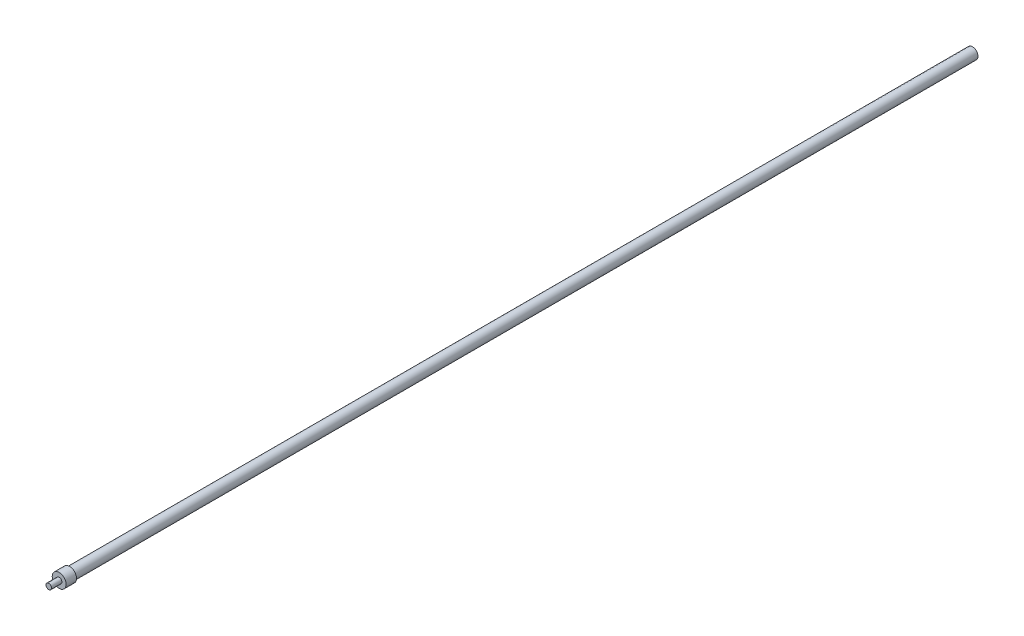
ISO-10303-21;
HEADER;
FILE_DESCRIPTION(('STEP AP214'),'2;1');
FILE_NAME('part.step','',(''),(''),'','','');
FILE_SCHEMA(('AUTOMOTIVE_DESIGN { 1 0 10303 214 1 1 1 1 }'));
ENDSEC;
DATA;
#1=APPLICATION_CONTEXT('core data for automotive mechanical design processes');
#2=APPLICATION_PROTOCOL_DEFINITION('international standard','automotive_design',2000,#1);
#3=PRODUCT_CONTEXT('',#1,'mechanical');
#4=PRODUCT('Part','Part','',(#3));
#5=PRODUCT_RELATED_PRODUCT_CATEGORY('part','',(#4));
#6=PRODUCT_DEFINITION_FORMATION('','',#4);
#7=PRODUCT_DEFINITION_CONTEXT('part definition',#1,'design');
#8=PRODUCT_DEFINITION('design','',#6,#7);
#9=PRODUCT_DEFINITION_SHAPE('','',#8);
#10=(LENGTH_UNIT() NAMED_UNIT(*) SI_UNIT(.MILLI.,.METRE.));
#11=(NAMED_UNIT(*) PLANE_ANGLE_UNIT() SI_UNIT($,.RADIAN.));
#12=(NAMED_UNIT(*) SI_UNIT($,.STERADIAN.) SOLID_ANGLE_UNIT());
#13=UNCERTAINTY_MEASURE_WITH_UNIT(LENGTH_MEASURE(1.E-05),#10,'distance_accuracy_value','');
#14=(GEOMETRIC_REPRESENTATION_CONTEXT(3) GLOBAL_UNCERTAINTY_ASSIGNED_CONTEXT((#13)) GLOBAL_UNIT_ASSIGNED_CONTEXT((#10,
#11,#12)) REPRESENTATION_CONTEXT('',''));
#15=CARTESIAN_POINT('',(0.,0.,0.));
#16=DIRECTION('',(0.,0.,1.));
#17=DIRECTION('',(1.,0.,0.));
#18=AXIS2_PLACEMENT_3D('',#15,#16,#17);
#19=CARTESIAN_POINT('',(0.,0.,1040.));
#20=DIRECTION('',(0.,0.,-1.));
#21=DIRECTION('',(-1.,0.,0.));
#22=AXIS2_PLACEMENT_3D('',#19,#20,#21);
#23=CYLINDRICAL_SURFACE('',#22,6.35);
#24=CARTESIAN_POINT('',(0.,0.,1040.));
#25=DIRECTION('',(0.,0.,1.));
#26=DIRECTION('',(1.,0.,0.));
#27=AXIS2_PLACEMENT_3D('',#24,#25,#26);
#28=CIRCLE('',#27,6.35);
#29=CARTESIAN_POINT('',(6.35,0.,1040.));
#30=VERTEX_POINT('',#29);
#31=EDGE_CURVE('E10',#30,#30,#28,.T.);
#32=ORIENTED_EDGE('',*,*,#31,.F.);
#33=EDGE_LOOP('',(#32));
#34=FACE_BOUND('',#33,.T.);
#35=CARTESIAN_POINT('',(0.,0.,0.));
#36=DIRECTION('',(0.,0.,1.));
#37=DIRECTION('',(1.,0.,0.));
#38=AXIS2_PLACEMENT_3D('',#35,#36,#37);
#39=CIRCLE('',#38,6.35);
#40=CARTESIAN_POINT('',(6.35,0.,0.));
#41=VERTEX_POINT('',#40);
#42=EDGE_CURVE('E36',#41,#41,#39,.T.);
#43=ORIENTED_EDGE('',*,*,#42,.T.);
#44=EDGE_LOOP('',(#43));
#45=FACE_BOUND('',#44,.T.);
#46=ADVANCED_FACE('F33',(#34,#45),#23,.T.);
#47=CARTESIAN_POINT('',(0.,0.,0.));
#48=DIRECTION('',(0.,0.,1.));
#49=DIRECTION('',(1.,0.,0.));
#50=AXIS2_PLACEMENT_3D('',#47,#48,#49);
#51=PLANE('',#50);
#52=ORIENTED_EDGE('',*,*,#42,.F.);
#53=EDGE_LOOP('',(#52));
#54=FACE_BOUND('',#53,.T.);
#55=ADVANCED_FACE('F75',(#54),#51,.F.);
#56=CARTESIAN_POINT('',(0.,0.,1052.));
#57=DIRECTION('',(0.,0.,-1.));
#58=DIRECTION('',(-1.,0.,0.));
#59=AXIS2_PLACEMENT_3D('',#56,#57,#58);
#60=CYLINDRICAL_SURFACE('',#59,8.);
#61=CARTESIAN_POINT('',(0.,0.,1052.));
#62=DIRECTION('',(0.,0.,1.));
#63=DIRECTION('',(1.,0.,0.));
#64=AXIS2_PLACEMENT_3D('',#61,#62,#63);
#65=CIRCLE('',#64,8.);
#66=CARTESIAN_POINT('',(8.,0.,1052.));
#67=VERTEX_POINT('',#66);
#68=EDGE_CURVE('E43',#67,#67,#65,.T.);
#69=ORIENTED_EDGE('',*,*,#68,.F.);
#70=EDGE_LOOP('',(#69));
#71=FACE_BOUND('',#70,.T.);
#72=CARTESIAN_POINT('',(0.,0.,1040.));
#73=DIRECTION('',(0.,0.,1.));
#74=DIRECTION('',(1.,0.,0.));
#75=AXIS2_PLACEMENT_3D('',#72,#73,#74);
#76=CIRCLE('',#75,8.);
#77=CARTESIAN_POINT('',(8.,0.,1040.));
#78=VERTEX_POINT('',#77);
#79=EDGE_CURVE('E45',#78,#78,#76,.T.);
#80=ORIENTED_EDGE('',*,*,#79,.T.);
#81=EDGE_LOOP('',(#80));
#82=FACE_BOUND('',#81,.T.);
#83=ADVANCED_FACE('F69',(#71,#82),#60,.T.);
#84=CARTESIAN_POINT('',(0.,0.,1052.));
#85=DIRECTION('',(0.,0.,1.));
#86=DIRECTION('',(1.,0.,0.));
#87=AXIS2_PLACEMENT_3D('',#84,#85,#86);
#88=PLANE('',#87);
#89=CARTESIAN_POINT('',(0.,0.,1052.));
#90=DIRECTION('',(0.,0.,1.));
#91=DIRECTION('',(1.,0.,0.));
#92=AXIS2_PLACEMENT_3D('',#89,#90,#91);
#93=CIRCLE('',#92,3.175);
#94=CARTESIAN_POINT('',(3.175,0.,1052.));
#95=VERTEX_POINT('',#94);
#96=EDGE_CURVE('E51',#95,#95,#93,.T.);
#97=ORIENTED_EDGE('',*,*,#96,.F.);
#98=EDGE_LOOP('',(#97));
#99=FACE_BOUND('',#98,.T.);
#100=ORIENTED_EDGE('',*,*,#68,.T.);
#101=EDGE_LOOP('',(#100));
#102=FACE_BOUND('',#101,.T.);
#103=ADVANCED_FACE('F66',(#99,#102),#88,.T.);
#104=CARTESIAN_POINT('',(0.,0.,1040.));
#105=DIRECTION('',(0.,0.,1.));
#106=DIRECTION('',(1.,0.,0.));
#107=AXIS2_PLACEMENT_3D('',#104,#105,#106);
#108=PLANE('',#107);
#109=ORIENTED_EDGE('',*,*,#31,.T.);
#110=EDGE_LOOP('',(#109));
#111=FACE_BOUND('',#110,.T.);
#112=ORIENTED_EDGE('',*,*,#79,.F.);
#113=EDGE_LOOP('',(#112));
#114=FACE_BOUND('',#113,.T.);
#115=ADVANCED_FACE('F62',(#111,#114),#108,.F.);
#116=CARTESIAN_POINT('',(0.,0.,1064.));
#117=DIRECTION('',(0.,0.,-1.));
#118=DIRECTION('',(-1.,0.,0.));
#119=AXIS2_PLACEMENT_3D('',#116,#117,#118);
#120=CYLINDRICAL_SURFACE('',#119,3.175);
#121=CARTESIAN_POINT('',(0.,0.,1064.));
#122=DIRECTION('',(0.,0.,1.));
#123=DIRECTION('',(1.,0.,0.));
#124=AXIS2_PLACEMENT_3D('',#121,#122,#123);
#125=CIRCLE('',#124,3.175);
#126=CARTESIAN_POINT('',(3.175,0.,1064.));
#127=VERTEX_POINT('',#126);
#128=EDGE_CURVE('E48',#127,#127,#125,.T.);
#129=ORIENTED_EDGE('',*,*,#128,.F.);
#130=EDGE_LOOP('',(#129));
#131=FACE_BOUND('',#130,.T.);
#132=ORIENTED_EDGE('',*,*,#96,.T.);
#133=EDGE_LOOP('',(#132));
#134=FACE_BOUND('',#133,.T.);
#135=ADVANCED_FACE('F59',(#131,#134),#120,.T.);
#136=CARTESIAN_POINT('',(0.,0.,1064.));
#137=DIRECTION('',(0.,0.,1.));
#138=DIRECTION('',(1.,0.,0.));
#139=AXIS2_PLACEMENT_3D('',#136,#137,#138);
#140=PLANE('',#139);
#141=ORIENTED_EDGE('',*,*,#128,.T.);
#142=EDGE_LOOP('',(#141));
#143=FACE_BOUND('',#142,.T.);
#144=ADVANCED_FACE('F57',(#143),#140,.T.);
#145=CLOSED_SHELL('',(#46,#55,#83,#103,#115,#135,#144));
#146=MANIFOLD_SOLID_BREP('B2',#145);
#147=ADVANCED_BREP_SHAPE_REPRESENTATION('',(#18,#146),#14);
#148=SHAPE_DEFINITION_REPRESENTATION(#9,#147);
ENDSEC;
END-ISO-10303-21;
